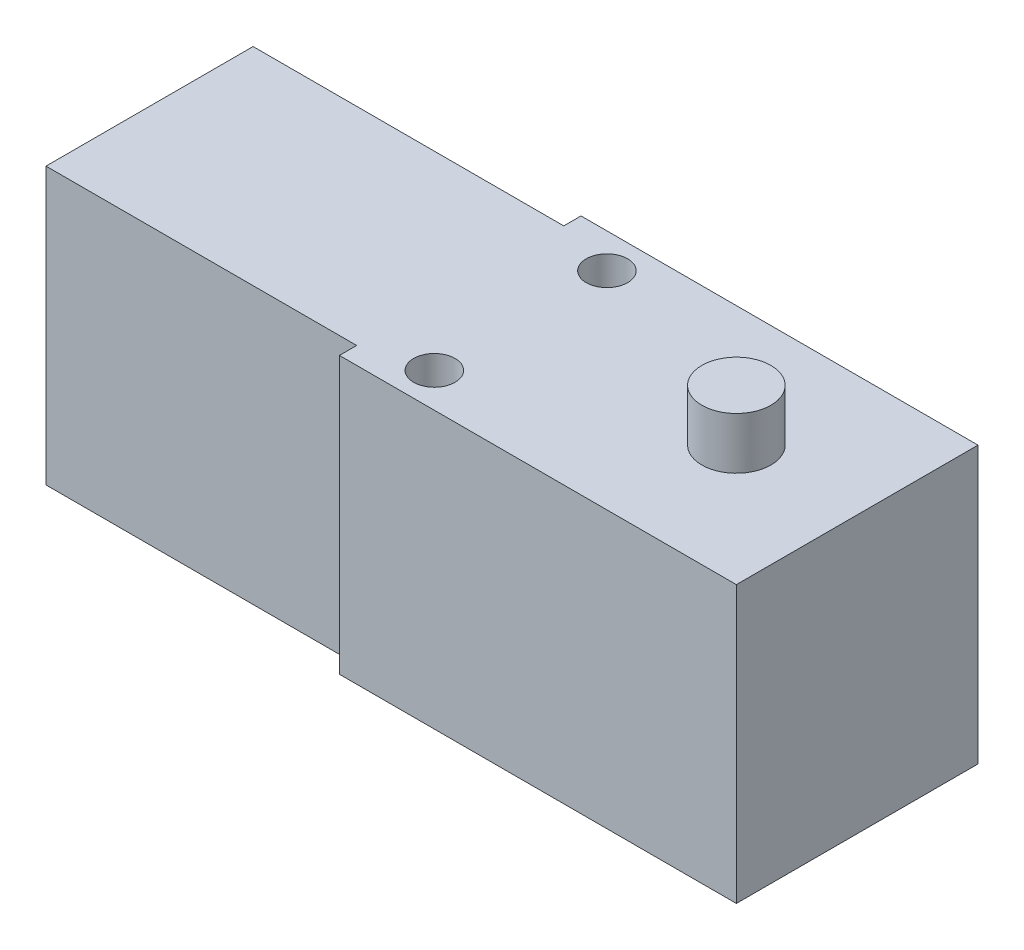
ISO-10303-21;
HEADER;
FILE_DESCRIPTION(('STEP AP214'),'2;1');
FILE_NAME('part.step','',(''),(''),'','','');
FILE_SCHEMA(('AUTOMOTIVE_DESIGN { 1 0 10303 214 1 1 1 1 }'));
ENDSEC;
DATA;
#1=APPLICATION_CONTEXT('core data for automotive mechanical design processes');
#2=APPLICATION_PROTOCOL_DEFINITION('international standard','automotive_design',2000,#1);
#3=PRODUCT_CONTEXT('',#1,'mechanical');
#4=PRODUCT('Part','Part','',(#3));
#5=PRODUCT_RELATED_PRODUCT_CATEGORY('part','',(#4));
#6=PRODUCT_DEFINITION_FORMATION('','',#4);
#7=PRODUCT_DEFINITION_CONTEXT('part definition',#1,'design');
#8=PRODUCT_DEFINITION('design','',#6,#7);
#9=PRODUCT_DEFINITION_SHAPE('','',#8);
#10=(LENGTH_UNIT() NAMED_UNIT(*) SI_UNIT(.MILLI.,.METRE.));
#11=(NAMED_UNIT(*) PLANE_ANGLE_UNIT() SI_UNIT($,.RADIAN.));
#12=(NAMED_UNIT(*) SI_UNIT($,.STERADIAN.) SOLID_ANGLE_UNIT());
#13=UNCERTAINTY_MEASURE_WITH_UNIT(LENGTH_MEASURE(1.E-05),#10,'distance_accuracy_value','');
#14=(GEOMETRIC_REPRESENTATION_CONTEXT(3) GLOBAL_UNCERTAINTY_ASSIGNED_CONTEXT((#13)) GLOBAL_UNIT_ASSIGNED_CONTEXT((#10,
#11,#12)) REPRESENTATION_CONTEXT('',''));
#15=CARTESIAN_POINT('',(0.,0.,0.));
#16=DIRECTION('',(0.,0.,1.));
#17=DIRECTION('',(1.,0.,0.));
#18=AXIS2_PLACEMENT_3D('',#15,#16,#17);
#19=CARTESIAN_POINT('',(0.,12.7,9.525));
#20=DIRECTION('',(0.,0.,-1.));
#21=DIRECTION('',(-1.,0.,0.));
#22=AXIS2_PLACEMENT_3D('',#19,#20,#21);
#23=PLANE('',#22);
#24=DIRECTION('',(1.,0.,0.));
#25=VECTOR('',#24,1.);
#26=CARTESIAN_POINT('',(0.,-12.7,9.525));
#27=LINE('',#26,#25);
#28=CARTESIAN_POINT('',(-28.575,-12.7,9.525));
#29=VERTEX_POINT('',#28);
#30=CARTESIAN_POINT('',(0.,-12.7,9.525));
#31=VERTEX_POINT('',#30);
#32=EDGE_CURVE('E142',#29,#31,#27,.T.);
#33=ORIENTED_EDGE('',*,*,#32,.T.);
#34=DIRECTION('',(0.,-1.,0.));
#35=VECTOR('',#34,1.);
#36=CARTESIAN_POINT('',(0.,12.7,9.525));
#37=LINE('',#36,#35);
#38=CARTESIAN_POINT('',(0.,12.7,9.525));
#39=VERTEX_POINT('',#38);
#40=EDGE_CURVE('E49',#39,#31,#37,.T.);
#41=ORIENTED_EDGE('',*,*,#40,.F.);
#42=DIRECTION('',(1.,0.,0.));
#43=VECTOR('',#42,1.);
#44=CARTESIAN_POINT('',(0.,12.7,9.525));
#45=LINE('',#44,#43);
#46=CARTESIAN_POINT('',(-28.575,12.7,9.525));
#47=VERTEX_POINT('',#46);
#48=EDGE_CURVE('E95',#47,#39,#45,.T.);
#49=ORIENTED_EDGE('',*,*,#48,.F.);
#50=DIRECTION('',(0.,-1.,0.));
#51=VECTOR('',#50,1.);
#52=CARTESIAN_POINT('',(-28.575,12.7,9.525));
#53=LINE('',#52,#51);
#54=EDGE_CURVE('E57',#47,#29,#53,.T.);
#55=ORIENTED_EDGE('',*,*,#54,.T.);
#56=EDGE_LOOP('',(#33,#41,#49,#55));
#57=FACE_BOUND('',#56,.T.);
#58=ADVANCED_FACE('F40',(#57),#23,.F.);
#59=CARTESIAN_POINT('',(0.,12.7,0.));
#60=DIRECTION('',(-1.,0.,0.));
#61=DIRECTION('',(0.,0.,1.));
#62=AXIS2_PLACEMENT_3D('',#59,#60,#61);
#63=PLANE('',#62);
#64=DIRECTION('',(0.,0.,-1.));
#65=VECTOR('',#64,1.);
#66=CARTESIAN_POINT('',(0.,-12.7,0.));
#67=LINE('',#66,#65);
#68=CARTESIAN_POINT('',(0.,-12.7,11.1125));
#69=VERTEX_POINT('',#68);
#70=EDGE_CURVE('E145',#69,#31,#67,.T.);
#71=ORIENTED_EDGE('',*,*,#70,.F.);
#72=DIRECTION('',(0.,-1.,0.));
#73=VECTOR('',#72,1.);
#74=CARTESIAN_POINT('',(0.,12.7,11.1125));
#75=LINE('',#74,#73);
#76=CARTESIAN_POINT('',(0.,12.7,11.1125));
#77=VERTEX_POINT('',#76);
#78=EDGE_CURVE('E181',#77,#69,#75,.T.);
#79=ORIENTED_EDGE('',*,*,#78,.F.);
#80=DIRECTION('',(0.,0.,-1.));
#81=VECTOR('',#80,1.);
#82=CARTESIAN_POINT('',(0.,12.7,0.));
#83=LINE('',#82,#81);
#84=EDGE_CURVE('E132',#77,#39,#83,.T.);
#85=ORIENTED_EDGE('',*,*,#84,.T.);
#86=ORIENTED_EDGE('',*,*,#40,.T.);
#87=EDGE_LOOP('',(#71,#79,#85,#86));
#88=FACE_BOUND('',#87,.T.);
#89=ADVANCED_FACE('F187',(#88),#63,.T.);
#90=CARTESIAN_POINT('',(0.,12.7,11.1125));
#91=DIRECTION('',(0.,0.,1.));
#92=DIRECTION('',(1.,0.,0.));
#93=AXIS2_PLACEMENT_3D('',#90,#91,#92);
#94=PLANE('',#93);
#95=DIRECTION('',(-1.,0.,0.));
#96=VECTOR('',#95,1.);
#97=CARTESIAN_POINT('',(0.,-12.7,11.1125));
#98=LINE('',#97,#96);
#99=CARTESIAN_POINT('',(36.5125,-12.7,11.1125));
#100=VERTEX_POINT('',#99);
#101=EDGE_CURVE('E150',#100,#69,#98,.T.);
#102=ORIENTED_EDGE('',*,*,#101,.F.);
#103=DIRECTION('',(0.,-1.,0.));
#104=VECTOR('',#103,1.);
#105=CARTESIAN_POINT('',(36.5125,12.7,11.1125));
#106=LINE('',#105,#104);
#107=CARTESIAN_POINT('',(36.5125,12.7,11.1125));
#108=VERTEX_POINT('',#107);
#109=EDGE_CURVE('E178',#108,#100,#106,.T.);
#110=ORIENTED_EDGE('',*,*,#109,.F.);
#111=DIRECTION('',(-1.,0.,0.));
#112=VECTOR('',#111,1.);
#113=CARTESIAN_POINT('',(0.,12.7,11.1125));
#114=LINE('',#113,#112);
#115=EDGE_CURVE('E198',#108,#77,#114,.T.);
#116=ORIENTED_EDGE('',*,*,#115,.T.);
#117=ORIENTED_EDGE('',*,*,#78,.T.);
#118=EDGE_LOOP('',(#102,#110,#116,#117));
#119=FACE_BOUND('',#118,.T.);
#120=ADVANCED_FACE('F194',(#119),#94,.T.);
#121=CARTESIAN_POINT('',(36.5125,12.7,0.));
#122=DIRECTION('',(-1.,0.,0.));
#123=DIRECTION('',(0.,0.,1.));
#124=AXIS2_PLACEMENT_3D('',#121,#122,#123);
#125=PLANE('',#124);
#126=DIRECTION('',(0.,0.,-1.));
#127=VECTOR('',#126,1.);
#128=CARTESIAN_POINT('',(36.5125,-12.7,0.));
#129=LINE('',#128,#127);
#130=CARTESIAN_POINT('',(36.5125,-12.7,-11.1125));
#131=VERTEX_POINT('',#130);
#132=EDGE_CURVE('E154',#100,#131,#129,.T.);
#133=ORIENTED_EDGE('',*,*,#132,.T.);
#134=DIRECTION('',(0.,-1.,0.));
#135=VECTOR('',#134,1.);
#136=CARTESIAN_POINT('',(36.5125,12.7,-11.1125));
#137=LINE('',#136,#135);
#138=CARTESIAN_POINT('',(36.5125,12.7,-11.1125));
#139=VERTEX_POINT('',#138);
#140=EDGE_CURVE('E174',#139,#131,#137,.T.);
#141=ORIENTED_EDGE('',*,*,#140,.F.);
#142=DIRECTION('',(0.,0.,-1.));
#143=VECTOR('',#142,1.);
#144=CARTESIAN_POINT('',(36.5125,12.7,0.));
#145=LINE('',#144,#143);
#146=EDGE_CURVE('E202',#108,#139,#145,.T.);
#147=ORIENTED_EDGE('',*,*,#146,.F.);
#148=ORIENTED_EDGE('',*,*,#109,.T.);
#149=EDGE_LOOP('',(#133,#141,#147,#148));
#150=FACE_BOUND('',#149,.T.);
#151=ADVANCED_FACE('F210',(#150),#125,.F.);
#152=CARTESIAN_POINT('',(0.,12.7,-11.1125));
#153=DIRECTION('',(0.,0.,1.));
#154=DIRECTION('',(1.,0.,0.));
#155=AXIS2_PLACEMENT_3D('',#152,#153,#154);
#156=PLANE('',#155);
#157=DIRECTION('',(-1.,0.,0.));
#158=VECTOR('',#157,1.);
#159=CARTESIAN_POINT('',(0.,-12.7,-11.1125));
#160=LINE('',#159,#158);
#161=CARTESIAN_POINT('',(0.,-12.7,-11.1125));
#162=VERTEX_POINT('',#161);
#163=EDGE_CURVE('E157',#131,#162,#160,.T.);
#164=ORIENTED_EDGE('',*,*,#163,.T.);
#165=DIRECTION('',(0.,-1.,0.));
#166=VECTOR('',#165,1.);
#167=CARTESIAN_POINT('',(0.,12.7,-11.1125));
#168=LINE('',#167,#166);
#169=CARTESIAN_POINT('',(0.,12.7,-11.1125));
#170=VERTEX_POINT('',#169);
#171=EDGE_CURVE('E122',#170,#162,#168,.T.);
#172=ORIENTED_EDGE('',*,*,#171,.F.);
#173=DIRECTION('',(-1.,0.,0.));
#174=VECTOR('',#173,1.);
#175=CARTESIAN_POINT('',(0.,12.7,-11.1125));
#176=LINE('',#175,#174);
#177=EDGE_CURVE('E128',#139,#170,#176,.T.);
#178=ORIENTED_EDGE('',*,*,#177,.F.);
#179=ORIENTED_EDGE('',*,*,#140,.T.);
#180=EDGE_LOOP('',(#164,#172,#178,#179));
#181=FACE_BOUND('',#180,.T.);
#182=ADVANCED_FACE('F212',(#181),#156,.F.);
#183=CARTESIAN_POINT('',(0.,-12.7,-9.525));
#184=VERTEX_POINT('',#183);
#185=EDGE_CURVE('E117',#184,#162,#67,.T.);
#186=ORIENTED_EDGE('',*,*,#185,.F.);
#187=DIRECTION('',(0.,-1.,0.));
#188=VECTOR('',#187,1.);
#189=CARTESIAN_POINT('',(0.,12.7,-9.525));
#190=LINE('',#189,#188);
#191=CARTESIAN_POINT('',(0.,12.7,-9.525));
#192=VERTEX_POINT('',#191);
#193=EDGE_CURVE('E112',#192,#184,#190,.T.);
#194=ORIENTED_EDGE('',*,*,#193,.F.);
#195=EDGE_CURVE('E115',#192,#170,#83,.T.);
#196=ORIENTED_EDGE('',*,*,#195,.T.);
#197=ORIENTED_EDGE('',*,*,#171,.T.);
#198=EDGE_LOOP('',(#186,#194,#196,#197));
#199=FACE_BOUND('',#198,.T.);
#200=ADVANCED_FACE('F114',(#199),#63,.T.);
#201=CARTESIAN_POINT('',(0.,12.7,-9.525));
#202=DIRECTION('',(0.,0.,-1.));
#203=DIRECTION('',(-1.,0.,0.));
#204=AXIS2_PLACEMENT_3D('',#201,#202,#203);
#205=PLANE('',#204);
#206=DIRECTION('',(1.,0.,0.));
#207=VECTOR('',#206,1.);
#208=CARTESIAN_POINT('',(0.,-12.7,-9.525));
#209=LINE('',#208,#207);
#210=CARTESIAN_POINT('',(-28.575,-12.7,-9.525));
#211=VERTEX_POINT('',#210);
#212=EDGE_CURVE('E161',#211,#184,#209,.T.);
#213=ORIENTED_EDGE('',*,*,#212,.F.);
#214=DIRECTION('',(0.,-1.,0.));
#215=VECTOR('',#214,1.);
#216=CARTESIAN_POINT('',(-28.575,12.7,-9.525));
#217=LINE('',#216,#215);
#218=CARTESIAN_POINT('',(-28.575,12.7,-9.525));
#219=VERTEX_POINT('',#218);
#220=EDGE_CURVE('E83',#219,#211,#217,.T.);
#221=ORIENTED_EDGE('',*,*,#220,.F.);
#222=DIRECTION('',(1.,0.,0.));
#223=VECTOR('',#222,1.);
#224=CARTESIAN_POINT('',(0.,12.7,-9.525));
#225=LINE('',#224,#223);
#226=EDGE_CURVE('E126',#219,#192,#225,.T.);
#227=ORIENTED_EDGE('',*,*,#226,.T.);
#228=ORIENTED_EDGE('',*,*,#193,.T.);
#229=EDGE_LOOP('',(#213,#221,#227,#228));
#230=FACE_BOUND('',#229,.T.);
#231=ADVANCED_FACE('F133',(#230),#205,.T.);
#232=CARTESIAN_POINT('',(-28.575,12.7,0.));
#233=DIRECTION('',(-1.,0.,0.));
#234=DIRECTION('',(0.,0.,1.));
#235=AXIS2_PLACEMENT_3D('',#232,#233,#234);
#236=PLANE('',#235);
#237=DIRECTION('',(0.,0.,-1.));
#238=VECTOR('',#237,1.);
#239=CARTESIAN_POINT('',(-28.575,-12.7,0.));
#240=LINE('',#239,#238);
#241=EDGE_CURVE('E164',#29,#211,#240,.T.);
#242=ORIENTED_EDGE('',*,*,#241,.F.);
#243=ORIENTED_EDGE('',*,*,#54,.F.);
#244=DIRECTION('',(0.,0.,-1.));
#245=VECTOR('',#244,1.);
#246=CARTESIAN_POINT('',(-28.575,12.7,0.));
#247=LINE('',#246,#245);
#248=EDGE_CURVE('E135',#47,#219,#247,.T.);
#249=ORIENTED_EDGE('',*,*,#248,.T.);
#250=ORIENTED_EDGE('',*,*,#220,.T.);
#251=EDGE_LOOP('',(#242,#243,#249,#250));
#252=FACE_BOUND('',#251,.T.);
#253=ADVANCED_FACE('F282',(#252),#236,.T.);
#254=CARTESIAN_POINT('',(0.,12.7,0.));
#255=DIRECTION('',(0.,1.,0.));
#256=DIRECTION('',(0.,0.,1.));
#257=AXIS2_PLACEMENT_3D('',#254,#255,#256);
#258=PLANE('',#257);
#259=CARTESIAN_POINT('',(5.55625,12.7,7.9375));
#260=DIRECTION('',(0.,1.,0.));
#261=DIRECTION('',(0.,0.,1.));
#262=AXIS2_PLACEMENT_3D('',#259,#260,#261);
#263=CIRCLE('',#262,1.905);
#264=CARTESIAN_POINT('',(5.55625,12.7,6.0325));
#265=VERTEX_POINT('',#264);
#266=EDGE_CURVE('E224',#265,#265,#263,.T.);
#267=ORIENTED_EDGE('',*,*,#266,.F.);
#268=EDGE_LOOP('',(#267));
#269=FACE_BOUND('',#268,.T.);
#270=CARTESIAN_POINT('',(5.55625,12.7,-7.9375));
#271=DIRECTION('',(0.,1.,0.));
#272=DIRECTION('',(0.,0.,1.));
#273=AXIS2_PLACEMENT_3D('',#270,#271,#272);
#274=CIRCLE('',#273,1.905);
#275=CARTESIAN_POINT('',(5.55625,12.7,-9.8425));
#276=VERTEX_POINT('',#275);
#277=EDGE_CURVE('E228',#276,#276,#274,.T.);
#278=ORIENTED_EDGE('',*,*,#277,.F.);
#279=EDGE_LOOP('',(#278));
#280=FACE_BOUND('',#279,.T.);
#281=CARTESIAN_POINT('',(25.4,12.7,0.));
#282=DIRECTION('',(0.,1.,0.));
#283=DIRECTION('',(0.,0.,1.));
#284=AXIS2_PLACEMENT_3D('',#281,#282,#283);
#285=CIRCLE('',#284,3.17500000000001);
#286=CARTESIAN_POINT('',(25.4,12.7,3.17500000000001));
#287=VERTEX_POINT('',#286);
#288=EDGE_CURVE('E146',#287,#287,#285,.F.);
#289=ORIENTED_EDGE('',*,*,#288,.T.);
#290=EDGE_LOOP('',(#289));
#291=FACE_BOUND('',#290,.T.);
#292=ORIENTED_EDGE('',*,*,#48,.T.);
#293=ORIENTED_EDGE('',*,*,#84,.F.);
#294=ORIENTED_EDGE('',*,*,#115,.F.);
#295=ORIENTED_EDGE('',*,*,#146,.T.);
#296=ORIENTED_EDGE('',*,*,#177,.T.);
#297=ORIENTED_EDGE('',*,*,#195,.F.);
#298=ORIENTED_EDGE('',*,*,#226,.F.);
#299=ORIENTED_EDGE('',*,*,#248,.F.);
#300=EDGE_LOOP('',(#292,#293,#294,#295,#296,#297,#298,#299));
#301=FACE_BOUND('',#300,.T.);
#302=ADVANCED_FACE('F125',(#269,#280,#291,#301),#258,.T.);
#303=CARTESIAN_POINT('',(0.,-12.7,0.));
#304=DIRECTION('',(0.,1.,0.));
#305=DIRECTION('',(0.,0.,1.));
#306=AXIS2_PLACEMENT_3D('',#303,#304,#305);
#307=PLANE('',#306);
#308=CARTESIAN_POINT('',(5.55625,-12.7,7.9375));
#309=DIRECTION('',(0.,-1.,0.));
#310=DIRECTION('',(0.,0.,-1.));
#311=AXIS2_PLACEMENT_3D('',#308,#309,#310);
#312=CIRCLE('',#311,1.905);
#313=CARTESIAN_POINT('',(5.55625,-12.7,6.0325));
#314=VERTEX_POINT('',#313);
#315=EDGE_CURVE('E232',#314,#314,#312,.T.);
#316=ORIENTED_EDGE('',*,*,#315,.F.);
#317=EDGE_LOOP('',(#316));
#318=FACE_BOUND('',#317,.T.);
#319=CARTESIAN_POINT('',(5.55625,-12.7,-7.9375));
#320=DIRECTION('',(0.,-1.,0.));
#321=DIRECTION('',(0.,0.,-1.));
#322=AXIS2_PLACEMENT_3D('',#319,#320,#321);
#323=CIRCLE('',#322,1.905);
#324=CARTESIAN_POINT('',(5.55625,-12.7,-9.8425));
#325=VERTEX_POINT('',#324);
#326=EDGE_CURVE('E236',#325,#325,#323,.T.);
#327=ORIENTED_EDGE('',*,*,#326,.F.);
#328=EDGE_LOOP('',(#327));
#329=FACE_BOUND('',#328,.T.);
#330=CARTESIAN_POINT('',(25.4,-12.7,0.));
#331=DIRECTION('',(0.,1.,0.));
#332=DIRECTION('',(0.,0.,1.));
#333=AXIS2_PLACEMENT_3D('',#330,#331,#332);
#334=CIRCLE('',#333,3.17500000000001);
#335=CARTESIAN_POINT('',(25.4,-12.7,3.17500000000001));
#336=VERTEX_POINT('',#335);
#337=EDGE_CURVE('E11',#336,#336,#334,.F.);
#338=ORIENTED_EDGE('',*,*,#337,.F.);
#339=EDGE_LOOP('',(#338));
#340=FACE_BOUND('',#339,.T.);
#341=ORIENTED_EDGE('',*,*,#32,.F.);
#342=ORIENTED_EDGE('',*,*,#241,.T.);
#343=ORIENTED_EDGE('',*,*,#212,.T.);
#344=ORIENTED_EDGE('',*,*,#185,.T.);
#345=ORIENTED_EDGE('',*,*,#163,.F.);
#346=ORIENTED_EDGE('',*,*,#132,.F.);
#347=ORIENTED_EDGE('',*,*,#101,.T.);
#348=ORIENTED_EDGE('',*,*,#70,.T.);
#349=EDGE_LOOP('',(#341,#342,#343,#344,#345,#346,#347,#348));
#350=FACE_BOUND('',#349,.T.);
#351=ADVANCED_FACE('F189',(#318,#329,#340,#350),#307,.F.);
#352=CARTESIAN_POINT('',(25.4,-17.4625,0.));
#353=DIRECTION('',(0.,-1.,0.));
#354=DIRECTION('',(0.,0.,-1.));
#355=AXIS2_PLACEMENT_3D('',#352,#353,#354);
#356=PLANE('',#355);
#357=CARTESIAN_POINT('',(25.4,-17.4625,0.));
#358=DIRECTION('',(0.,-1.,0.));
#359=DIRECTION('',(0.,0.,-1.));
#360=AXIS2_PLACEMENT_3D('',#357,#358,#359);
#361=CIRCLE('',#360,3.17500000000001);
#362=CARTESIAN_POINT('',(25.4,-17.4625,-3.17500000000001));
#363=VERTEX_POINT('',#362);
#364=EDGE_CURVE('E217',#363,#363,#361,.T.);
#365=ORIENTED_EDGE('',*,*,#364,.T.);
#366=EDGE_LOOP('',(#365));
#367=FACE_BOUND('',#366,.T.);
#368=ADVANCED_FACE('F246',(#367),#356,.T.);
#369=CARTESIAN_POINT('',(25.4,-17.4625,0.));
#370=DIRECTION('',(0.,1.,0.));
#371=DIRECTION('',(0.,0.,1.));
#372=AXIS2_PLACEMENT_3D('',#369,#370,#371);
#373=CYLINDRICAL_SURFACE('',#372,3.17500000000001);
#374=ORIENTED_EDGE('',*,*,#364,.F.);
#375=EDGE_LOOP('',(#374));
#376=FACE_BOUND('',#375,.T.);
#377=ORIENTED_EDGE('',*,*,#337,.T.);
#378=EDGE_LOOP('',(#377));
#379=FACE_BOUND('',#378,.T.);
#380=ADVANCED_FACE('F251',(#376,#379),#373,.T.);
#381=ORIENTED_EDGE('',*,*,#288,.F.);
#382=EDGE_LOOP('',(#381));
#383=FACE_BOUND('',#382,.T.);
#384=CARTESIAN_POINT('',(25.4,17.4625,0.));
#385=DIRECTION('',(0.,-1.,0.));
#386=DIRECTION('',(0.,0.,-1.));
#387=AXIS2_PLACEMENT_3D('',#384,#385,#386);
#388=CIRCLE('',#387,3.17500000000001);
#389=CARTESIAN_POINT('',(25.4,17.4625,-3.17500000000001));
#390=VERTEX_POINT('',#389);
#391=EDGE_CURVE('E220',#390,#390,#388,.T.);
#392=ORIENTED_EDGE('',*,*,#391,.T.);
#393=EDGE_LOOP('',(#392));
#394=FACE_BOUND('',#393,.T.);
#395=ADVANCED_FACE('F253',(#383,#394),#373,.T.);
#396=CARTESIAN_POINT('',(25.4,17.4625,0.));
#397=DIRECTION('',(0.,-1.,0.));
#398=DIRECTION('',(0.,0.,-1.));
#399=AXIS2_PLACEMENT_3D('',#396,#397,#398);
#400=PLANE('',#399);
#401=ORIENTED_EDGE('',*,*,#391,.F.);
#402=EDGE_LOOP('',(#401));
#403=FACE_BOUND('',#402,.T.);
#404=ADVANCED_FACE('F260',(#403),#400,.F.);
#405=CARTESIAN_POINT('',(5.55625,17.4625,-7.9375));
#406=DIRECTION('',(0.,-1.,0.));
#407=DIRECTION('',(0.,0.,-1.));
#408=AXIS2_PLACEMENT_3D('',#405,#406,#407);
#409=CYLINDRICAL_SURFACE('',#408,1.905);
#410=CARTESIAN_POINT('',(5.55625,12.7,-9.8425));
#411=CARTESIAN_POINT('',(5.55625,12.4354166666667,-9.8425));
#412=CARTESIAN_POINT('',(5.55625,12.1708333333333,-9.8425));
#413=CARTESIAN_POINT('',(5.55625,11.6416666666667,-9.8425));
#414=CARTESIAN_POINT('',(5.55625,11.3770833333333,-9.8425));
#415=CARTESIAN_POINT('',(5.55625,10.8479166666667,-9.8425));
#416=CARTESIAN_POINT('',(5.55625,10.5833333333333,-9.8425));
#417=CARTESIAN_POINT('',(5.55625,10.0541666666667,-9.8425));
#418=CARTESIAN_POINT('',(5.55625,9.78958333333333,-9.8425));
#419=CARTESIAN_POINT('',(5.55625,9.26041666666667,-9.8425));
#420=CARTESIAN_POINT('',(5.55625,8.99583333333333,-9.8425));
#421=CARTESIAN_POINT('',(5.55625,8.46666666666667,-9.8425));
#422=CARTESIAN_POINT('',(5.55625,8.20208333333333,-9.8425));
#423=CARTESIAN_POINT('',(5.55625,7.67291666666667,-9.8425));
#424=CARTESIAN_POINT('',(5.55625,7.40833333333333,-9.8425));
#425=CARTESIAN_POINT('',(5.55625,6.87916666666667,-9.8425));
#426=CARTESIAN_POINT('',(5.55625,6.61458333333333,-9.8425));
#427=CARTESIAN_POINT('',(5.55625,6.08541666666667,-9.8425));
#428=CARTESIAN_POINT('',(5.55625,5.82083333333333,-9.8425));
#429=CARTESIAN_POINT('',(5.55625,5.29166666666667,-9.8425));
#430=CARTESIAN_POINT('',(5.55625,5.02708333333333,-9.8425));
#431=CARTESIAN_POINT('',(5.55625,4.49791666666667,-9.8425));
#432=CARTESIAN_POINT('',(5.55625,4.23333333333333,-9.8425));
#433=CARTESIAN_POINT('',(5.55625,3.70416666666667,-9.8425));
#434=CARTESIAN_POINT('',(5.55625,3.43958333333333,-9.8425));
#435=CARTESIAN_POINT('',(5.55625,2.91041666666667,-9.8425));
#436=CARTESIAN_POINT('',(5.55625,2.64583333333333,-9.8425));
#437=CARTESIAN_POINT('',(5.55625,2.11666666666667,-9.8425));
#438=CARTESIAN_POINT('',(5.55625,1.85208333333333,-9.8425));
#439=CARTESIAN_POINT('',(5.55625,1.32291666666667,-9.8425));
#440=CARTESIAN_POINT('',(5.55625,1.05833333333333,-9.8425));
#441=CARTESIAN_POINT('',(5.55625,0.529166666666667,-9.8425));
#442=CARTESIAN_POINT('',(5.55625,0.264583333333335,-9.8425));
#443=CARTESIAN_POINT('',(5.55625,-0.264583333333331,-9.8425));
#444=CARTESIAN_POINT('',(5.55625,-0.529166666666665,-9.8425));
#445=CARTESIAN_POINT('',(5.55625,-1.05833333333333,-9.8425));
#446=CARTESIAN_POINT('',(5.55625,-1.32291666666667,-9.8425));
#447=CARTESIAN_POINT('',(5.55625,-1.85208333333333,-9.8425));
#448=CARTESIAN_POINT('',(5.55625,-2.11666666666666,-9.8425));
#449=CARTESIAN_POINT('',(5.55625,-2.64583333333333,-9.8425));
#450=CARTESIAN_POINT('',(5.55625,-2.91041666666667,-9.8425));
#451=CARTESIAN_POINT('',(5.55625,-3.43958333333333,-9.8425));
#452=CARTESIAN_POINT('',(5.55625,-3.70416666666666,-9.8425));
#453=CARTESIAN_POINT('',(5.55625,-4.23333333333333,-9.8425));
#454=CARTESIAN_POINT('',(5.55625,-4.49791666666667,-9.8425));
#455=CARTESIAN_POINT('',(5.55625,-5.02708333333333,-9.8425));
#456=CARTESIAN_POINT('',(5.55625,-5.29166666666666,-9.8425));
#457=CARTESIAN_POINT('',(5.55625,-5.82083333333333,-9.8425));
#458=CARTESIAN_POINT('',(5.55625,-6.08541666666666,-9.8425));
#459=CARTESIAN_POINT('',(5.55625,-6.61458333333333,-9.8425));
#460=CARTESIAN_POINT('',(5.55625,-6.87916666666667,-9.8425));
#461=CARTESIAN_POINT('',(5.55625,-7.40833333333333,-9.8425));
#462=CARTESIAN_POINT('',(5.55625,-7.67291666666666,-9.8425));
#463=CARTESIAN_POINT('',(5.55625,-8.20208333333333,-9.8425));
#464=CARTESIAN_POINT('',(5.55625,-8.46666666666667,-9.8425));
#465=CARTESIAN_POINT('',(5.55625,-8.99583333333333,-9.8425));
#466=CARTESIAN_POINT('',(5.55625,-9.26041666666666,-9.8425));
#467=CARTESIAN_POINT('',(5.55625,-9.78958333333333,-9.8425));
#468=CARTESIAN_POINT('',(5.55625,-10.0541666666667,-9.8425));
#469=CARTESIAN_POINT('',(5.55625,-10.5833333333333,-9.8425));
#470=CARTESIAN_POINT('',(5.55625,-10.8479166666667,-9.8425));
#471=CARTESIAN_POINT('',(5.55625,-11.3770833333333,-9.8425));
#472=CARTESIAN_POINT('',(5.55625,-11.6416666666667,-9.8425));
#473=CARTESIAN_POINT('',(5.55625,-12.1708333333333,-9.8425));
#474=CARTESIAN_POINT('',(5.55625,-12.4354166666667,-9.8425));
#475=CARTESIAN_POINT('',(5.55625,-12.7,-9.8425));
#476=B_SPLINE_CURVE_WITH_KNOTS('',3,(#410,#411,#412,#413,#414,#415,#416,#417,#418,#419,#420,
#421,#422,#423,#424,#425,#426,#427,#428,#429,#430,#431,#432,#433,#434,#435,#436,#437,#438,#439,
#440,#441,#442,#443,#444,#445,#446,#447,#448,#449,#450,#451,#452,#453,#454,#455,#456,#457,#458,
#459,#460,#461,#462,#463,#464,#465,#466,#467,#468,#469,#470,#471,#472,#473,#474,#475),
.UNSPECIFIED.,.F.,.F.,(4,2,2,2,2,2,2,2,2,2,2,2,2,2,2,2,2,2,2,2,2,2,2,2,2,2,2,2,2,2,2,2,4),(0.,
0.793750000000001,1.5875,2.38125,3.175,3.96875,4.7625,5.55625,6.35,7.14375,7.9375,8.73125,9.525,
10.31875,11.1125,11.90625,12.7,13.49375,14.2875,15.08125,15.875,16.66875,17.4625,18.25625,19.05,
19.84375,20.6375,21.43125,22.225,23.01875,23.8125,24.60625,25.4),.UNSPECIFIED.);
#477=EDGE_CURVE('BSEAM242',#276,#325,#476,.T.);
#478=ORIENTED_EDGE('',*,*,#277,.T.);
#479=ORIENTED_EDGE('',*,*,#326,.T.);
#480=ORIENTED_EDGE('',*,*,#477,.T.);
#481=ORIENTED_EDGE('',*,*,#477,.F.);
#482=EDGE_LOOP('',(#478,#480,#479,#481));
#483=FACE_BOUND('',#482,.T.);
#484=ADVANCED_FACE('F242',(#483),#409,.F.);
#485=CARTESIAN_POINT('',(5.55625,17.4625,7.9375));
#486=DIRECTION('',(0.,-1.,0.));
#487=DIRECTION('',(0.,0.,-1.));
#488=AXIS2_PLACEMENT_3D('',#485,#486,#487);
#489=CYLINDRICAL_SURFACE('',#488,1.905);
#490=CARTESIAN_POINT('',(5.55625,12.7,6.0325));
#491=CARTESIAN_POINT('',(5.55625,12.4354166666667,6.0325));
#492=CARTESIAN_POINT('',(5.55625,12.1708333333333,6.0325));
#493=CARTESIAN_POINT('',(5.55625,11.6416666666667,6.0325));
#494=CARTESIAN_POINT('',(5.55625,11.3770833333333,6.0325));
#495=CARTESIAN_POINT('',(5.55625,10.8479166666667,6.0325));
#496=CARTESIAN_POINT('',(5.55625,10.5833333333333,6.0325));
#497=CARTESIAN_POINT('',(5.55625,10.0541666666667,6.0325));
#498=CARTESIAN_POINT('',(5.55625,9.78958333333333,6.0325));
#499=CARTESIAN_POINT('',(5.55625,9.26041666666667,6.0325));
#500=CARTESIAN_POINT('',(5.55625,8.99583333333333,6.0325));
#501=CARTESIAN_POINT('',(5.55625,8.46666666666667,6.0325));
#502=CARTESIAN_POINT('',(5.55625,8.20208333333333,6.0325));
#503=CARTESIAN_POINT('',(5.55625,7.67291666666667,6.0325));
#504=CARTESIAN_POINT('',(5.55625,7.40833333333333,6.0325));
#505=CARTESIAN_POINT('',(5.55625,6.87916666666667,6.0325));
#506=CARTESIAN_POINT('',(5.55625,6.61458333333333,6.0325));
#507=CARTESIAN_POINT('',(5.55625,6.08541666666667,6.0325));
#508=CARTESIAN_POINT('',(5.55625,5.82083333333333,6.0325));
#509=CARTESIAN_POINT('',(5.55625,5.29166666666667,6.0325));
#510=CARTESIAN_POINT('',(5.55625,5.02708333333333,6.0325));
#511=CARTESIAN_POINT('',(5.55625,4.49791666666667,6.0325));
#512=CARTESIAN_POINT('',(5.55625,4.23333333333333,6.0325));
#513=CARTESIAN_POINT('',(5.55625,3.70416666666667,6.0325));
#514=CARTESIAN_POINT('',(5.55625,3.43958333333333,6.0325));
#515=CARTESIAN_POINT('',(5.55625,2.91041666666667,6.0325));
#516=CARTESIAN_POINT('',(5.55625,2.64583333333333,6.0325));
#517=CARTESIAN_POINT('',(5.55625,2.11666666666667,6.0325));
#518=CARTESIAN_POINT('',(5.55625,1.85208333333333,6.0325));
#519=CARTESIAN_POINT('',(5.55625,1.32291666666667,6.0325));
#520=CARTESIAN_POINT('',(5.55625,1.05833333333333,6.0325));
#521=CARTESIAN_POINT('',(5.55625,0.529166666666667,6.0325));
#522=CARTESIAN_POINT('',(5.55625,0.264583333333335,6.0325));
#523=CARTESIAN_POINT('',(5.55625,-0.264583333333331,6.0325));
#524=CARTESIAN_POINT('',(5.55625,-0.529166666666665,6.0325));
#525=CARTESIAN_POINT('',(5.55625,-1.05833333333333,6.0325));
#526=CARTESIAN_POINT('',(5.55625,-1.32291666666667,6.0325));
#527=CARTESIAN_POINT('',(5.55625,-1.85208333333333,6.0325));
#528=CARTESIAN_POINT('',(5.55625,-2.11666666666666,6.0325));
#529=CARTESIAN_POINT('',(5.55625,-2.64583333333333,6.0325));
#530=CARTESIAN_POINT('',(5.55625,-2.91041666666667,6.0325));
#531=CARTESIAN_POINT('',(5.55625,-3.43958333333333,6.0325));
#532=CARTESIAN_POINT('',(5.55625,-3.70416666666666,6.0325));
#533=CARTESIAN_POINT('',(5.55625,-4.23333333333333,6.0325));
#534=CARTESIAN_POINT('',(5.55625,-4.49791666666667,6.0325));
#535=CARTESIAN_POINT('',(5.55625,-5.02708333333333,6.0325));
#536=CARTESIAN_POINT('',(5.55625,-5.29166666666666,6.0325));
#537=CARTESIAN_POINT('',(5.55625,-5.82083333333333,6.0325));
#538=CARTESIAN_POINT('',(5.55625,-6.08541666666666,6.0325));
#539=CARTESIAN_POINT('',(5.55625,-6.61458333333333,6.0325));
#540=CARTESIAN_POINT('',(5.55625,-6.87916666666667,6.0325));
#541=CARTESIAN_POINT('',(5.55625,-7.40833333333333,6.0325));
#542=CARTESIAN_POINT('',(5.55625,-7.67291666666666,6.0325));
#543=CARTESIAN_POINT('',(5.55625,-8.20208333333333,6.0325));
#544=CARTESIAN_POINT('',(5.55625,-8.46666666666667,6.0325));
#545=CARTESIAN_POINT('',(5.55625,-8.99583333333333,6.0325));
#546=CARTESIAN_POINT('',(5.55625,-9.26041666666666,6.0325));
#547=CARTESIAN_POINT('',(5.55625,-9.78958333333333,6.0325));
#548=CARTESIAN_POINT('',(5.55625,-10.0541666666667,6.0325));
#549=CARTESIAN_POINT('',(5.55625,-10.5833333333333,6.0325));
#550=CARTESIAN_POINT('',(5.55625,-10.8479166666667,6.0325));
#551=CARTESIAN_POINT('',(5.55625,-11.3770833333333,6.0325));
#552=CARTESIAN_POINT('',(5.55625,-11.6416666666667,6.0325));
#553=CARTESIAN_POINT('',(5.55625,-12.1708333333333,6.0325));
#554=CARTESIAN_POINT('',(5.55625,-12.4354166666667,6.0325));
#555=CARTESIAN_POINT('',(5.55625,-12.7,6.0325));
#556=B_SPLINE_CURVE_WITH_KNOTS('',3,(#490,#491,#492,#493,#494,#495,#496,#497,#498,#499,#500,
#501,#502,#503,#504,#505,#506,#507,#508,#509,#510,#511,#512,#513,#514,#515,#516,#517,#518,#519,
#520,#521,#522,#523,#524,#525,#526,#527,#528,#529,#530,#531,#532,#533,#534,#535,#536,#537,#538,
#539,#540,#541,#542,#543,#544,#545,#546,#547,#548,#549,#550,#551,#552,#553,#554,#555),
.UNSPECIFIED.,.F.,.F.,(4,2,2,2,2,2,2,2,2,2,2,2,2,2,2,2,2,2,2,2,2,2,2,2,2,2,2,2,2,2,2,2,4),(0.,
0.793750000000001,1.5875,2.38125,3.175,3.96875,4.7625,5.55625,6.35,7.14375,7.9375,8.73125,9.525,
10.31875,11.1125,11.90625,12.7,13.49375,14.2875,15.08125,15.875,16.66875,17.4625,18.25625,19.05,
19.84375,20.6375,21.43125,22.225,23.01875,23.8125,24.60625,25.4),.UNSPECIFIED.);
#557=EDGE_CURVE('BSEAM378',#265,#314,#556,.T.);
#558=ORIENTED_EDGE('',*,*,#266,.T.);
#559=ORIENTED_EDGE('',*,*,#315,.T.);
#560=ORIENTED_EDGE('',*,*,#557,.T.);
#561=ORIENTED_EDGE('',*,*,#557,.F.);
#562=EDGE_LOOP('',(#558,#560,#559,#561));
#563=FACE_BOUND('',#562,.T.);
#564=ADVANCED_FACE('F378',(#563),#489,.F.);
#565=CLOSED_SHELL('',(#58,#89,#120,#151,#182,#200,#231,#253,#302,#351,#368,#380,#395,#404,#484,#564));
#566=MANIFOLD_SOLID_BREP('B2',#565);
#567=ADVANCED_BREP_SHAPE_REPRESENTATION('',(#18,#566),#14);
#568=SHAPE_DEFINITION_REPRESENTATION(#9,#567);
ENDSEC;
END-ISO-10303-21;
